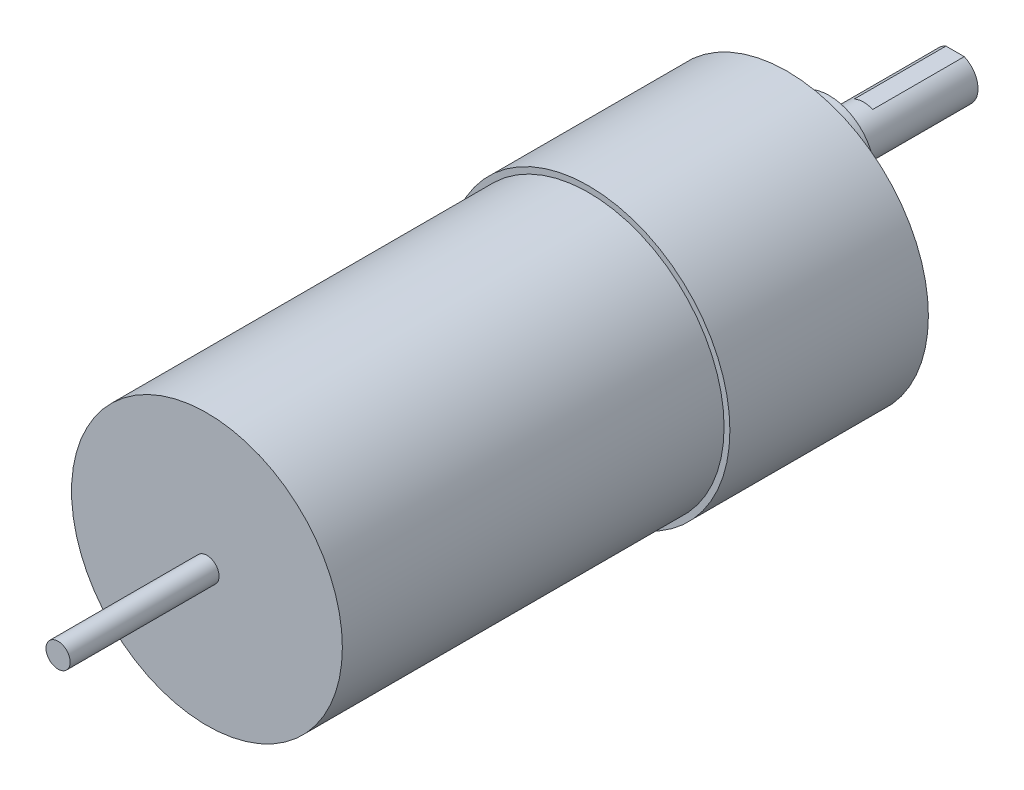
ISO-10303-21;
HEADER;
FILE_DESCRIPTION(('STEP AP214'),'2;1');
FILE_NAME('part.step','',(''),(''),'','','');
FILE_SCHEMA(('AUTOMOTIVE_DESIGN { 1 0 10303 214 1 1 1 1 }'));
ENDSEC;
DATA;
#1=APPLICATION_CONTEXT('core data for automotive mechanical design processes');
#2=APPLICATION_PROTOCOL_DEFINITION('international standard','automotive_design',2000,#1);
#3=PRODUCT_CONTEXT('',#1,'mechanical');
#4=PRODUCT('Part','Part','',(#3));
#5=PRODUCT_RELATED_PRODUCT_CATEGORY('part','',(#4));
#6=PRODUCT_DEFINITION_FORMATION('','',#4);
#7=PRODUCT_DEFINITION_CONTEXT('part definition',#1,'design');
#8=PRODUCT_DEFINITION('design','',#6,#7);
#9=PRODUCT_DEFINITION_SHAPE('','',#8);
#10=(LENGTH_UNIT() NAMED_UNIT(*) SI_UNIT(.MILLI.,.METRE.));
#11=(NAMED_UNIT(*) PLANE_ANGLE_UNIT() SI_UNIT($,.RADIAN.));
#12=(NAMED_UNIT(*) SI_UNIT($,.STERADIAN.) SOLID_ANGLE_UNIT());
#13=UNCERTAINTY_MEASURE_WITH_UNIT(LENGTH_MEASURE(1.E-05),#10,'distance_accuracy_value','');
#14=(GEOMETRIC_REPRESENTATION_CONTEXT(3) GLOBAL_UNCERTAINTY_ASSIGNED_CONTEXT((#13)) GLOBAL_UNIT_ASSIGNED_CONTEXT((#10,
#11,#12)) REPRESENTATION_CONTEXT('',''));
#15=CARTESIAN_POINT('',(0.,0.,0.));
#16=DIRECTION('',(0.,0.,1.));
#17=DIRECTION('',(1.,0.,0.));
#18=AXIS2_PLACEMENT_3D('',#15,#16,#17);
#19=CARTESIAN_POINT('',(0.,0.,26.));
#20=DIRECTION('',(0.,0.,-1.));
#21=DIRECTION('',(-1.,0.,0.));
#22=AXIS2_PLACEMENT_3D('',#19,#20,#21);
#23=CYLINDRICAL_SURFACE('',#22,18.5);
#24=CARTESIAN_POINT('',(0.,0.,26.));
#25=DIRECTION('',(0.,0.,1.));
#26=DIRECTION('',(1.,0.,0.));
#27=AXIS2_PLACEMENT_3D('',#24,#25,#26);
#28=CIRCLE('',#27,18.5);
#29=CARTESIAN_POINT('',(-18.5,0.,26.));
#30=VERTEX_POINT('',#29);
#31=EDGE_CURVE('E93',#30,#30,#28,.T.);
#32=CARTESIAN_POINT('',(0.,0.,0.));
#33=DIRECTION('',(0.,0.,1.));
#34=DIRECTION('',(1.,0.,0.));
#35=AXIS2_PLACEMENT_3D('',#32,#33,#34);
#36=CIRCLE('',#35,18.5);
#37=CARTESIAN_POINT('',(-18.5,0.,0.));
#38=VERTEX_POINT('',#37);
#39=EDGE_CURVE('E89',#38,#38,#36,.T.);
#40=CARTESIAN_POINT('',(-18.5,0.,26.));
#41=CARTESIAN_POINT('',(-18.5,0.,25.7291666666667));
#42=CARTESIAN_POINT('',(-18.5,0.,25.4583333333333));
#43=CARTESIAN_POINT('',(-18.5,0.,24.9166666666667));
#44=CARTESIAN_POINT('',(-18.5,0.,24.6458333333333));
#45=CARTESIAN_POINT('',(-18.5,0.,24.1041666666667));
#46=CARTESIAN_POINT('',(-18.5,0.,23.8333333333333));
#47=CARTESIAN_POINT('',(-18.5,0.,23.2916666666667));
#48=CARTESIAN_POINT('',(-18.5,0.,23.0208333333333));
#49=CARTESIAN_POINT('',(-18.5,0.,22.4791666666667));
#50=CARTESIAN_POINT('',(-18.5,0.,22.2083333333333));
#51=CARTESIAN_POINT('',(-18.5,0.,21.6666666666667));
#52=CARTESIAN_POINT('',(-18.5,0.,21.3958333333333));
#53=CARTESIAN_POINT('',(-18.5,0.,20.8541666666667));
#54=CARTESIAN_POINT('',(-18.5,0.,20.5833333333333));
#55=CARTESIAN_POINT('',(-18.5,0.,20.0416666666667));
#56=CARTESIAN_POINT('',(-18.5,0.,19.7708333333333));
#57=CARTESIAN_POINT('',(-18.5,0.,19.2291666666667));
#58=CARTESIAN_POINT('',(-18.5,0.,18.9583333333333));
#59=CARTESIAN_POINT('',(-18.5,0.,18.4166666666667));
#60=CARTESIAN_POINT('',(-18.5,0.,18.1458333333333));
#61=CARTESIAN_POINT('',(-18.5,0.,17.6041666666667));
#62=CARTESIAN_POINT('',(-18.5,0.,17.3333333333333));
#63=CARTESIAN_POINT('',(-18.5,0.,16.7916666666667));
#64=CARTESIAN_POINT('',(-18.5,0.,16.5208333333333));
#65=CARTESIAN_POINT('',(-18.5,0.,15.9791666666667));
#66=CARTESIAN_POINT('',(-18.5,0.,15.7083333333333));
#67=CARTESIAN_POINT('',(-18.5,0.,15.1666666666667));
#68=CARTESIAN_POINT('',(-18.5,0.,14.8958333333333));
#69=CARTESIAN_POINT('',(-18.5,0.,14.3541666666667));
#70=CARTESIAN_POINT('',(-18.5,0.,14.0833333333333));
#71=CARTESIAN_POINT('',(-18.5,0.,13.5416666666667));
#72=CARTESIAN_POINT('',(-18.5,0.,13.2708333333333));
#73=CARTESIAN_POINT('',(-18.5,0.,12.7291666666667));
#74=CARTESIAN_POINT('',(-18.5,0.,12.4583333333333));
#75=CARTESIAN_POINT('',(-18.5,0.,11.9166666666667));
#76=CARTESIAN_POINT('',(-18.5,0.,11.6458333333333));
#77=CARTESIAN_POINT('',(-18.5,0.,11.1041666666667));
#78=CARTESIAN_POINT('',(-18.5,0.,10.8333333333333));
#79=CARTESIAN_POINT('',(-18.5,0.,10.2916666666667));
#80=CARTESIAN_POINT('',(-18.5,0.,10.0208333333333));
#81=CARTESIAN_POINT('',(-18.5,0.,9.47916666666667));
#82=CARTESIAN_POINT('',(-18.5,0.,9.20833333333333));
#83=CARTESIAN_POINT('',(-18.5,0.,8.66666666666667));
#84=CARTESIAN_POINT('',(-18.5,0.,8.39583333333333));
#85=CARTESIAN_POINT('',(-18.5,0.,7.85416666666667));
#86=CARTESIAN_POINT('',(-18.5,0.,7.58333333333333));
#87=CARTESIAN_POINT('',(-18.5,0.,7.04166666666667));
#88=CARTESIAN_POINT('',(-18.5,0.,6.77083333333333));
#89=CARTESIAN_POINT('',(-18.5,0.,6.22916666666667));
#90=CARTESIAN_POINT('',(-18.5,0.,5.95833333333333));
#91=CARTESIAN_POINT('',(-18.5,0.,5.41666666666667));
#92=CARTESIAN_POINT('',(-18.5,0.,5.14583333333333));
#93=CARTESIAN_POINT('',(-18.5,0.,4.60416666666667));
#94=CARTESIAN_POINT('',(-18.5,0.,4.33333333333333));
#95=CARTESIAN_POINT('',(-18.5,0.,3.79166666666667));
#96=CARTESIAN_POINT('',(-18.5,0.,3.52083333333333));
#97=CARTESIAN_POINT('',(-18.5,0.,2.97916666666667));
#98=CARTESIAN_POINT('',(-18.5,0.,2.70833333333333));
#99=CARTESIAN_POINT('',(-18.5,0.,2.16666666666667));
#100=CARTESIAN_POINT('',(-18.5,0.,1.89583333333333));
#101=CARTESIAN_POINT('',(-18.5,0.,1.35416666666667));
#102=CARTESIAN_POINT('',(-18.5,0.,1.08333333333333));
#103=CARTESIAN_POINT('',(-18.5,0.,0.541666666666667));
#104=CARTESIAN_POINT('',(-18.5,0.,0.270833333333334));
#105=CARTESIAN_POINT('',(-18.5,0.,0.));
#106=B_SPLINE_CURVE_WITH_KNOTS('',3,(#40,#41,#42,#43,#44,#45,#46,#47,#48,#49,#50,#51,#52,#53,
#54,#55,#56,#57,#58,#59,#60,#61,#62,#63,#64,#65,#66,#67,#68,#69,#70,#71,#72,#73,#74,#75,#76,#77,
#78,#79,#80,#81,#82,#83,#84,#85,#86,#87,#88,#89,#90,#91,#92,#93,#94,#95,#96,#97,#98,#99,#100,
#101,#102,#103,#104,#105),.UNSPECIFIED.,.F.,.F.,(4,2,2,2,2,2,2,2,2,2,2,2,2,2,2,2,2,2,2,2,2,2,2,
2,2,2,2,2,2,2,2,2,4),(0.,0.812500000000001,1.625,2.4375,3.25,4.0625,4.875,5.6875,6.5,7.3125,
8.125,8.9375,9.75,10.5625,11.375,12.1875,13.,13.8125,14.625,15.4375,16.25,17.0625,17.875,
18.6875,19.5,20.3125,21.125,21.9375,22.75,23.5625,24.375,25.1875,26.),.UNSPECIFIED.);
#107=EDGE_CURVE('BSEAM32',#30,#38,#106,.T.);
#108=ORIENTED_EDGE('',*,*,#31,.F.);
#109=ORIENTED_EDGE('',*,*,#39,.T.);
#110=ORIENTED_EDGE('',*,*,#107,.T.);
#111=ORIENTED_EDGE('',*,*,#107,.F.);
#112=EDGE_LOOP('',(#108,#110,#109,#111));
#113=FACE_BOUND('',#112,.T.);
#114=ADVANCED_FACE('F32',(#113),#23,.T.);
#115=CARTESIAN_POINT('',(0.,0.,26.));
#116=DIRECTION('',(0.,0.,1.));
#117=DIRECTION('',(1.,0.,0.));
#118=AXIS2_PLACEMENT_3D('',#115,#116,#117);
#119=PLANE('',#118);
#120=CARTESIAN_POINT('',(0.,0.,26.));
#121=DIRECTION('',(0.,0.,1.));
#122=DIRECTION('',(1.,0.,0.));
#123=AXIS2_PLACEMENT_3D('',#120,#121,#122);
#124=CIRCLE('',#123,17.7381200842323);
#125=CARTESIAN_POINT('',(17.7381200842323,0.,26.));
#126=VERTEX_POINT('',#125);
#127=EDGE_CURVE('E90',#126,#126,#124,.T.);
#128=ORIENTED_EDGE('',*,*,#127,.F.);
#129=EDGE_LOOP('',(#128));
#130=FACE_BOUND('',#129,.T.);
#131=ORIENTED_EDGE('',*,*,#31,.T.);
#132=EDGE_LOOP('',(#131));
#133=FACE_BOUND('',#132,.T.);
#134=ADVANCED_FACE('F106',(#130,#133),#119,.T.);
#135=CARTESIAN_POINT('',(0.,0.,0.));
#136=DIRECTION('',(0.,0.,1.));
#137=DIRECTION('',(1.,0.,0.));
#138=AXIS2_PLACEMENT_3D('',#135,#136,#137);
#139=PLANE('',#138);
#140=CARTESIAN_POINT('',(0.,7.,0.));
#141=DIRECTION('',(0.,0.,1.));
#142=DIRECTION('',(1.,0.,0.));
#143=AXIS2_PLACEMENT_3D('',#140,#141,#142);
#144=CIRCLE('',#143,6.);
#145=CARTESIAN_POINT('',(6.,7.,0.));
#146=VERTEX_POINT('',#145);
#147=EDGE_CURVE('E77',#146,#146,#144,.F.);
#148=ORIENTED_EDGE('',*,*,#147,.F.);
#149=EDGE_LOOP('',(#148));
#150=FACE_BOUND('',#149,.T.);
#151=ORIENTED_EDGE('',*,*,#39,.F.);
#152=EDGE_LOOP('',(#151));
#153=FACE_BOUND('',#152,.T.);
#154=ADVANCED_FACE('F102',(#150,#153),#139,.F.);
#155=CARTESIAN_POINT('',(0.,0.,76.));
#156=DIRECTION('',(0.,0.,-1.));
#157=DIRECTION('',(-1.,0.,0.));
#158=AXIS2_PLACEMENT_3D('',#155,#156,#157);
#159=CYLINDRICAL_SURFACE('',#158,17.7381200842323);
#160=CARTESIAN_POINT('',(0.,0.,76.));
#161=DIRECTION('',(0.,0.,1.));
#162=DIRECTION('',(1.,0.,0.));
#163=AXIS2_PLACEMENT_3D('',#160,#161,#162);
#164=CIRCLE('',#163,17.7381200842323);
#165=CARTESIAN_POINT('',(17.7381200842323,0.,76.));
#166=VERTEX_POINT('',#165);
#167=EDGE_CURVE('E84',#166,#166,#164,.T.);
#168=ORIENTED_EDGE('',*,*,#167,.F.);
#169=EDGE_LOOP('',(#168));
#170=FACE_BOUND('',#169,.T.);
#171=ORIENTED_EDGE('',*,*,#127,.T.);
#172=EDGE_LOOP('',(#171));
#173=FACE_BOUND('',#172,.T.);
#174=ADVANCED_FACE('F105',(#170,#173),#159,.T.);
#175=CARTESIAN_POINT('',(0.,0.,76.));
#176=DIRECTION('',(0.,0.,1.));
#177=DIRECTION('',(1.,0.,0.));
#178=AXIS2_PLACEMENT_3D('',#175,#176,#177);
#179=PLANE('',#178);
#180=CARTESIAN_POINT('',(0.,0.,76.));
#181=DIRECTION('',(0.,0.,1.));
#182=DIRECTION('',(1.,0.,0.));
#183=AXIS2_PLACEMENT_3D('',#180,#181,#182);
#184=CIRCLE('',#183,1.585);
#185=CARTESIAN_POINT('',(1.585,0.,76.));
#186=VERTEX_POINT('',#185);
#187=EDGE_CURVE('E80',#186,#186,#184,.T.);
#188=ORIENTED_EDGE('',*,*,#187,.F.);
#189=EDGE_LOOP('',(#188));
#190=FACE_BOUND('',#189,.T.);
#191=ORIENTED_EDGE('',*,*,#167,.T.);
#192=EDGE_LOOP('',(#191));
#193=FACE_BOUND('',#192,.T.);
#194=ADVANCED_FACE('F124',(#190,#193),#179,.T.);
#195=CARTESIAN_POINT('',(0.,0.,95.5));
#196=DIRECTION('',(0.,0.,-1.));
#197=DIRECTION('',(-1.,0.,0.));
#198=AXIS2_PLACEMENT_3D('',#195,#196,#197);
#199=CYLINDRICAL_SURFACE('',#198,1.585);
#200=CARTESIAN_POINT('',(0.,0.,95.5));
#201=DIRECTION('',(0.,0.,1.));
#202=DIRECTION('',(1.,0.,0.));
#203=AXIS2_PLACEMENT_3D('',#200,#201,#202);
#204=CIRCLE('',#203,1.585);
#205=CARTESIAN_POINT('',(1.585,0.,95.5));
#206=VERTEX_POINT('',#205);
#207=EDGE_CURVE('E81',#206,#206,#204,.T.);
#208=ORIENTED_EDGE('',*,*,#207,.F.);
#209=EDGE_LOOP('',(#208));
#210=FACE_BOUND('',#209,.T.);
#211=ORIENTED_EDGE('',*,*,#187,.T.);
#212=EDGE_LOOP('',(#211));
#213=FACE_BOUND('',#212,.T.);
#214=ADVANCED_FACE('F128',(#210,#213),#199,.T.);
#215=CARTESIAN_POINT('',(0.,0.,95.5));
#216=DIRECTION('',(0.,0.,1.));
#217=DIRECTION('',(1.,0.,0.));
#218=AXIS2_PLACEMENT_3D('',#215,#216,#217);
#219=PLANE('',#218);
#220=ORIENTED_EDGE('',*,*,#207,.T.);
#221=EDGE_LOOP('',(#220));
#222=FACE_BOUND('',#221,.T.);
#223=ADVANCED_FACE('F132',(#222),#219,.T.);
#224=CARTESIAN_POINT('',(0.,7.,-5.5));
#225=DIRECTION('',(0.,0.,1.));
#226=DIRECTION('',(1.,0.,0.));
#227=AXIS2_PLACEMENT_3D('',#224,#225,#226);
#228=CYLINDRICAL_SURFACE('',#227,6.);
#229=CARTESIAN_POINT('',(0.,7.,-5.5));
#230=DIRECTION('',(0.,0.,-1.));
#231=DIRECTION('',(-1.,0.,0.));
#232=AXIS2_PLACEMENT_3D('',#229,#230,#231);
#233=CIRCLE('',#232,6.);
#234=CARTESIAN_POINT('',(-6.00000000000001,7.,-5.5));
#235=VERTEX_POINT('',#234);
#236=EDGE_CURVE('E74',#235,#235,#233,.T.);
#237=ORIENTED_EDGE('',*,*,#236,.F.);
#238=EDGE_LOOP('',(#237));
#239=FACE_BOUND('',#238,.T.);
#240=ORIENTED_EDGE('',*,*,#147,.T.);
#241=EDGE_LOOP('',(#240));
#242=FACE_BOUND('',#241,.T.);
#243=ADVANCED_FACE('F100',(#239,#242),#228,.T.);
#244=CARTESIAN_POINT('',(0.,7.,-5.5));
#245=DIRECTION('',(0.,0.,-1.));
#246=DIRECTION('',(-1.,0.,0.));
#247=AXIS2_PLACEMENT_3D('',#244,#245,#246);
#248=PLANE('',#247);
#249=CARTESIAN_POINT('',(0.,7.,-5.5));
#250=DIRECTION('',(0.,0.,-1.));
#251=DIRECTION('',(-1.,0.,0.));
#252=AXIS2_PLACEMENT_3D('',#249,#250,#251);
#253=CIRCLE('',#252,3.);
#254=CARTESIAN_POINT('',(-3.,7.,-5.5));
#255=VERTEX_POINT('',#254);
#256=EDGE_CURVE('E40',#255,#255,#253,.T.);
#257=ORIENTED_EDGE('',*,*,#256,.F.);
#258=EDGE_LOOP('',(#257));
#259=FACE_BOUND('',#258,.T.);
#260=ORIENTED_EDGE('',*,*,#236,.T.);
#261=EDGE_LOOP('',(#260));
#262=FACE_BOUND('',#261,.T.);
#263=ADVANCED_FACE('F139',(#259,#262),#248,.T.);
#264=CARTESIAN_POINT('',(0.,7.,-22.));
#265=DIRECTION('',(0.,0.,1.));
#266=DIRECTION('',(1.,0.,0.));
#267=AXIS2_PLACEMENT_3D('',#264,#265,#266);
#268=CYLINDRICAL_SURFACE('',#267,3.);
#269=CARTESIAN_POINT('',(0.,7.,-22.));
#270=DIRECTION('',(0.,0.,-1.));
#271=DIRECTION('',(-1.,0.,0.));
#272=AXIS2_PLACEMENT_3D('',#269,#270,#271);
#273=CIRCLE('',#272,3.);
#274=CARTESIAN_POINT('',(1.19895788082818,9.75,-22.));
#275=VERTEX_POINT('',#274);
#276=CARTESIAN_POINT('',(-1.19895788082818,9.75,-22.));
#277=VERTEX_POINT('',#276);
#278=EDGE_CURVE('E69',#275,#277,#273,.T.);
#279=ORIENTED_EDGE('',*,*,#278,.F.);
#280=DIRECTION('',(0.,0.,-1.));
#281=VECTOR('',#280,1.);
#282=CARTESIAN_POINT('',(1.19895788082818,9.75,-10.));
#283=LINE('',#282,#281);
#284=CARTESIAN_POINT('',(1.19895788082818,9.75,-10.));
#285=VERTEX_POINT('',#284);
#286=EDGE_CURVE('E45',#285,#275,#283,.T.);
#287=ORIENTED_EDGE('',*,*,#286,.F.);
#288=CARTESIAN_POINT('',(0.,7.,-10.));
#289=DIRECTION('',(0.,0.,-1.));
#290=DIRECTION('',(-1.,0.,0.));
#291=AXIS2_PLACEMENT_3D('',#288,#289,#290);
#292=CIRCLE('',#291,3.);
#293=CARTESIAN_POINT('',(-1.19895788082818,9.75,-10.));
#294=VERTEX_POINT('',#293);
#295=EDGE_CURVE('E56',#294,#285,#292,.T.);
#296=ORIENTED_EDGE('',*,*,#295,.F.);
#297=DIRECTION('',(0.,0.,-1.));
#298=VECTOR('',#297,1.);
#299=CARTESIAN_POINT('',(-1.19895788082818,9.75,-10.));
#300=LINE('',#299,#298);
#301=EDGE_CURVE('E63',#294,#277,#300,.T.);
#302=ORIENTED_EDGE('',*,*,#301,.T.);
#303=EDGE_LOOP('',(#279,#287,#296,#302));
#304=FACE_BOUND('',#303,.T.);
#305=ORIENTED_EDGE('',*,*,#256,.T.);
#306=EDGE_LOOP('',(#305));
#307=FACE_BOUND('',#306,.T.);
#308=ADVANCED_FACE('F66',(#304,#307),#268,.T.);
#309=CARTESIAN_POINT('',(0.,7.,-22.));
#310=DIRECTION('',(0.,0.,-1.));
#311=DIRECTION('',(-1.,0.,0.));
#312=AXIS2_PLACEMENT_3D('',#309,#310,#311);
#313=PLANE('',#312);
#314=DIRECTION('',(1.,0.,0.));
#315=VECTOR('',#314,1.);
#316=CARTESIAN_POINT('',(0.,9.75,-22.));
#317=LINE('',#316,#315);
#318=EDGE_CURVE('E11',#275,#277,#317,.F.);
#319=ORIENTED_EDGE('',*,*,#318,.F.);
#320=ORIENTED_EDGE('',*,*,#278,.T.);
#321=EDGE_LOOP('',(#319,#320));
#322=FACE_BOUND('',#321,.T.);
#323=ADVANCED_FACE('F146',(#322),#313,.T.);
#324=CARTESIAN_POINT('',(0.,9.75,-10.));
#325=DIRECTION('',(0.,-1.,0.));
#326=DIRECTION('',(0.,0.,-1.));
#327=AXIS2_PLACEMENT_3D('',#324,#325,#326);
#328=PLANE('',#327);
#329=ORIENTED_EDGE('',*,*,#318,.T.);
#330=ORIENTED_EDGE('',*,*,#301,.F.);
#331=DIRECTION('',(-1.,0.,0.));
#332=VECTOR('',#331,1.);
#333=CARTESIAN_POINT('',(0.,9.75,-10.));
#334=LINE('',#333,#332);
#335=EDGE_CURVE('E58',#285,#294,#334,.T.);
#336=ORIENTED_EDGE('',*,*,#335,.F.);
#337=ORIENTED_EDGE('',*,*,#286,.T.);
#338=EDGE_LOOP('',(#329,#330,#336,#337));
#339=FACE_BOUND('',#338,.T.);
#340=ADVANCED_FACE('F62',(#339),#328,.F.);
#341=CARTESIAN_POINT('',(0.,0.,-10.));
#342=DIRECTION('',(0.,0.,-1.));
#343=DIRECTION('',(-1.,0.,0.));
#344=AXIS2_PLACEMENT_3D('',#341,#342,#343);
#345=PLANE('',#344);
#346=ORIENTED_EDGE('',*,*,#295,.T.);
#347=ORIENTED_EDGE('',*,*,#335,.T.);
#348=EDGE_LOOP('',(#346,#347));
#349=FACE_BOUND('',#348,.T.);
#350=ADVANCED_FACE('F57',(#349),#345,.T.);
#351=CLOSED_SHELL('',(#114,#134,#154,#174,#194,#214,#223,#243,#263,#308,#323,#340,#350));
#352=MANIFOLD_SOLID_BREP('B2',#351);
#353=ADVANCED_BREP_SHAPE_REPRESENTATION('',(#18,#352),#14);
#354=SHAPE_DEFINITION_REPRESENTATION(#9,#353);
ENDSEC;
END-ISO-10303-21;
